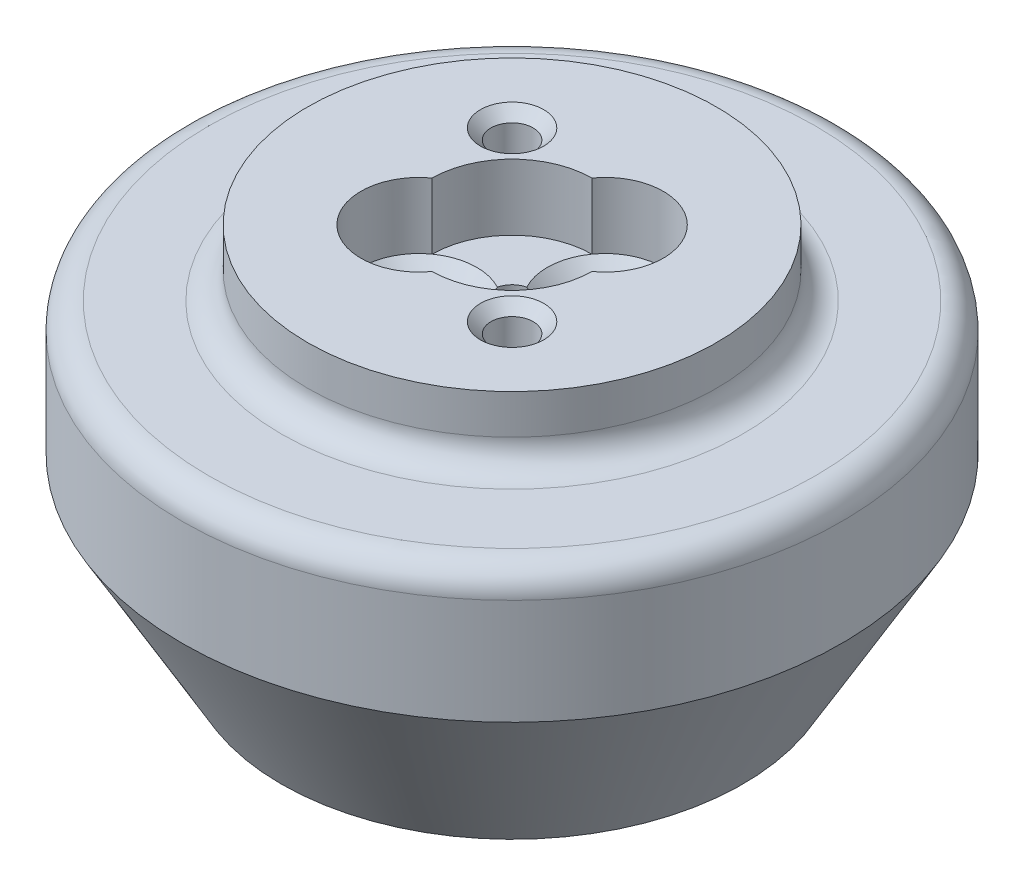
ISO-10303-21;
HEADER;
FILE_DESCRIPTION(('STEP AP214'),'2;1');
FILE_NAME('part.step','',(''),(''),'','','');
FILE_SCHEMA(('AUTOMOTIVE_DESIGN { 1 0 10303 214 1 1 1 1 }'));
ENDSEC;
DATA;
#1=APPLICATION_CONTEXT('core data for automotive mechanical design processes');
#2=APPLICATION_PROTOCOL_DEFINITION('international standard','automotive_design',2000,#1);
#3=PRODUCT_CONTEXT('',#1,'mechanical');
#4=PRODUCT('Part','Part','',(#3));
#5=PRODUCT_RELATED_PRODUCT_CATEGORY('part','',(#4));
#6=PRODUCT_DEFINITION_FORMATION('','',#4);
#7=PRODUCT_DEFINITION_CONTEXT('part definition',#1,'design');
#8=PRODUCT_DEFINITION('design','',#6,#7);
#9=PRODUCT_DEFINITION_SHAPE('','',#8);
#10=(LENGTH_UNIT() NAMED_UNIT(*) SI_UNIT(.MILLI.,.METRE.));
#11=(NAMED_UNIT(*) PLANE_ANGLE_UNIT() SI_UNIT($,.RADIAN.));
#12=(NAMED_UNIT(*) SI_UNIT($,.STERADIAN.) SOLID_ANGLE_UNIT());
#13=UNCERTAINTY_MEASURE_WITH_UNIT(LENGTH_MEASURE(1.E-05),#10,'distance_accuracy_value','');
#14=(GEOMETRIC_REPRESENTATION_CONTEXT(3) GLOBAL_UNCERTAINTY_ASSIGNED_CONTEXT((#13)) GLOBAL_UNIT_ASSIGNED_CONTEXT((#10,
#11,#12)) REPRESENTATION_CONTEXT('',''));
#15=CARTESIAN_POINT('',(0.,0.,0.));
#16=DIRECTION('',(0.,0.,1.));
#17=DIRECTION('',(1.,0.,0.));
#18=AXIS2_PLACEMENT_3D('',#15,#16,#17);
#19=CARTESIAN_POINT('',(0.,14.,0.));
#20=DIRECTION('',(0.,-1.,0.));
#21=DIRECTION('',(0.,0.,-1.));
#22=AXIS2_PLACEMENT_3D('',#19,#20,#21);
#23=CYLINDRICAL_SURFACE('',#22,3.05);
#24=DIRECTION('',(0.,1.,0.));
#25=VECTOR('',#24,1.);
#26=CARTESIAN_POINT('',(3.04993454359712,12.75,0.0199819862127667));
#27=LINE('',#26,#25);
#28=CARTESIAN_POINT('',(3.04993454359712,11.5,0.0199819862127656));
#29=VERTEX_POINT('',#28);
#30=CARTESIAN_POINT('',(3.04993454359712,14.,0.0199819862127667));
#31=VERTEX_POINT('',#30);
#32=EDGE_CURVE('E256',#29,#31,#27,.T.);
#33=ORIENTED_EDGE('',*,*,#32,.F.);
#34=CARTESIAN_POINT('',(0.,11.5,0.));
#35=DIRECTION('',(0.,1.,0.));
#36=DIRECTION('',(0.,0.,1.));
#37=AXIS2_PLACEMENT_3D('',#34,#35,#36);
#38=CIRCLE('',#37,3.05);
#39=CARTESIAN_POINT('',(0.0199819862127659,11.5,3.04993454359712));
#40=VERTEX_POINT('',#39);
#41=EDGE_CURVE('E133',#29,#40,#38,.F.);
#42=ORIENTED_EDGE('',*,*,#41,.T.);
#43=DIRECTION('',(0.,1.,0.));
#44=VECTOR('',#43,1.);
#45=CARTESIAN_POINT('',(0.0199819862127728,12.75,3.04993454359712));
#46=LINE('',#45,#44);
#47=CARTESIAN_POINT('',(0.019981986212773,14.,3.04993454359712));
#48=VERTEX_POINT('',#47);
#49=EDGE_CURVE('E69',#48,#40,#46,.F.);
#50=ORIENTED_EDGE('',*,*,#49,.F.);
#51=CARTESIAN_POINT('',(0.,14.,0.));
#52=DIRECTION('',(0.,1.,0.));
#53=DIRECTION('',(0.,0.,1.));
#54=AXIS2_PLACEMENT_3D('',#51,#52,#53);
#55=CIRCLE('',#54,3.05);
#56=EDGE_CURVE('E260',#48,#31,#55,.T.);
#57=ORIENTED_EDGE('',*,*,#56,.T.);
#58=EDGE_LOOP('',(#33,#42,#50,#57));
#59=FACE_BOUND('',#58,.T.);
#60=ADVANCED_FACE('F45',(#59),#23,.F.);
#61=CARTESIAN_POINT('',(0.,11.5,0.));
#62=DIRECTION('',(0.,1.,0.));
#63=DIRECTION('',(0.,0.,1.));
#64=AXIS2_PLACEMENT_3D('',#61,#62,#63);
#65=PLANE('',#64);
#66=CARTESIAN_POINT('',(0.,11.5,0.));
#67=DIRECTION('',(0.,1.,0.));
#68=DIRECTION('',(0.,0.,1.));
#69=AXIS2_PLACEMENT_3D('',#66,#67,#68);
#70=CIRCLE('',#69,0.75);
#71=CARTESIAN_POINT('',(0.172083928690773,11.5,0.729991179046945));
#72=VERTEX_POINT('',#71);
#73=CARTESIAN_POINT('',(0.729991179046948,11.5,0.17208392869076));
#74=VERTEX_POINT('',#73);
#75=EDGE_CURVE('E186',#72,#74,#70,.T.);
#76=ORIENTED_EDGE('',*,*,#75,.F.);
#77=CARTESIAN_POINT('',(-1.76776695296636,11.5,1.76776695296636));
#78=DIRECTION('',(0.,1.,0.));
#79=DIRECTION('',(0.,0.,1.));
#80=AXIS2_PLACEMENT_3D('',#77,#78,#79);
#81=CIRCLE('',#80,2.2);
#82=EDGE_CURVE('E109',#40,#72,#81,.T.);
#83=ORIENTED_EDGE('',*,*,#82,.F.);
#84=ORIENTED_EDGE('',*,*,#41,.F.);
#85=CARTESIAN_POINT('',(1.76776695296637,11.5,-1.76776695296637));
#86=DIRECTION('',(0.,1.,0.));
#87=DIRECTION('',(0.,0.,1.));
#88=AXIS2_PLACEMENT_3D('',#85,#86,#87);
#89=CIRCLE('',#88,2.2);
#90=EDGE_CURVE('E153',#74,#29,#89,.T.);
#91=ORIENTED_EDGE('',*,*,#90,.F.);
#92=EDGE_LOOP('',(#76,#83,#84,#91));
#93=FACE_BOUND('',#92,.T.);
#94=ADVANCED_FACE('F214',(#93),#65,.T.);
#95=CARTESIAN_POINT('',(0.,0.,0.));
#96=DIRECTION('',(0.,1.,0.));
#97=DIRECTION('',(0.,0.,1.));
#98=AXIS2_PLACEMENT_3D('',#95,#96,#97);
#99=PLANE('',#98);
#100=CARTESIAN_POINT('',(0.,0.,0.));
#101=DIRECTION('',(0.,1.,0.));
#102=DIRECTION('',(0.,0.,1.));
#103=AXIS2_PLACEMENT_3D('',#100,#101,#102);
#104=CIRCLE('',#103,8.75);
#105=CARTESIAN_POINT('',(0.,0.,8.75));
#106=VERTEX_POINT('',#105);
#107=EDGE_CURVE('E134',#106,#106,#104,.F.);
#108=ORIENTED_EDGE('',*,*,#107,.T.);
#109=EDGE_LOOP('',(#108));
#110=FACE_BOUND('',#109,.T.);
#111=CARTESIAN_POINT('',(0.,0.,0.));
#112=DIRECTION('',(0.,1.,0.));
#113=DIRECTION('',(0.,0.,1.));
#114=AXIS2_PLACEMENT_3D('',#111,#112,#113);
#115=CIRCLE('',#114,7.14375);
#116=CARTESIAN_POINT('',(0.,0.,7.14375));
#117=VERTEX_POINT('',#116);
#118=EDGE_CURVE('E290',#117,#117,#115,.T.);
#119=ORIENTED_EDGE('',*,*,#118,.T.);
#120=EDGE_LOOP('',(#119));
#121=FACE_BOUND('',#120,.T.);
#122=ADVANCED_FACE('F223',(#110,#121),#99,.F.);
#123=CARTESIAN_POINT('',(0.,10.,0.));
#124=DIRECTION('',(0.,-1.,0.));
#125=DIRECTION('',(0.,0.,-1.));
#126=AXIS2_PLACEMENT_3D('',#123,#124,#125);
#127=CYLINDRICAL_SURFACE('',#126,12.5);
#128=CARTESIAN_POINT('',(0.,10.5,0.));
#129=DIRECTION('',(0.,1.,0.));
#130=DIRECTION('',(0.,0.,1.));
#131=AXIS2_PLACEMENT_3D('',#128,#129,#130);
#132=CIRCLE('',#131,12.5);
#133=CARTESIAN_POINT('',(0.,10.5,12.5));
#134=VERTEX_POINT('',#133);
#135=EDGE_CURVE('E11',#134,#134,#132,.F.);
#136=ORIENTED_EDGE('',*,*,#135,.T.);
#137=EDGE_LOOP('',(#136));
#138=FACE_BOUND('',#137,.T.);
#139=CARTESIAN_POINT('',(0.,6.49519052838328,0.));
#140=DIRECTION('',(0.,1.,0.));
#141=DIRECTION('',(0.,0.,1.));
#142=AXIS2_PLACEMENT_3D('',#139,#140,#141);
#143=CIRCLE('',#142,12.5);
#144=CARTESIAN_POINT('',(0.,6.49519052838328,12.5));
#145=VERTEX_POINT('',#144);
#146=EDGE_CURVE('E140',#145,#145,#143,.T.);
#147=ORIENTED_EDGE('',*,*,#146,.T.);
#148=EDGE_LOOP('',(#147));
#149=FACE_BOUND('',#148,.T.);
#150=ADVANCED_FACE('F221',(#138,#149),#127,.T.);
#151=CARTESIAN_POINT('',(0.,10.,0.));
#152=DIRECTION('',(0.,-1.,0.));
#153=DIRECTION('',(0.,0.,-1.));
#154=AXIS2_PLACEMENT_3D('',#151,#152,#153);
#155=CYLINDRICAL_SURFACE('',#154,7.14375);
#156=CARTESIAN_POINT('',(0.,10.,0.));
#157=DIRECTION('',(0.,1.,0.));
#158=DIRECTION('',(0.,0.,1.));
#159=AXIS2_PLACEMENT_3D('',#156,#157,#158);
#160=CIRCLE('',#159,7.14375);
#161=CARTESIAN_POINT('',(0.,10.,7.14375));
#162=VERTEX_POINT('',#161);
#163=EDGE_CURVE('E286',#162,#162,#160,.T.);
#164=ORIENTED_EDGE('',*,*,#163,.T.);
#165=EDGE_LOOP('',(#164));
#166=FACE_BOUND('',#165,.T.);
#167=ORIENTED_EDGE('',*,*,#118,.F.);
#168=EDGE_LOOP('',(#167));
#169=FACE_BOUND('',#168,.T.);
#170=ADVANCED_FACE('F217',(#166,#169),#155,.F.);
#171=CARTESIAN_POINT('',(0.,10.,0.));
#172=DIRECTION('',(0.,1.,0.));
#173=DIRECTION('',(0.,0.,1.));
#174=AXIS2_PLACEMENT_3D('',#171,#172,#173);
#175=PLANE('',#174);
#176=CARTESIAN_POINT('',(3.18198051533945,10.,3.18198051533946));
#177=DIRECTION('',(0.,1.,0.));
#178=DIRECTION('',(0.,0.,1.));
#179=AXIS2_PLACEMENT_3D('',#176,#177,#178);
#180=CIRCLE('',#179,0.799999999999992);
#181=CARTESIAN_POINT('',(3.18198051533945,10.,3.98198051533946));
#182=VERTEX_POINT('',#181);
#183=EDGE_CURVE('E536',#182,#182,#180,.T.);
#184=ORIENTED_EDGE('',*,*,#183,.T.);
#185=EDGE_LOOP('',(#184));
#186=FACE_BOUND('',#185,.T.);
#187=CARTESIAN_POINT('',(-3.18198051533946,10.,-3.18198051533948));
#188=DIRECTION('',(0.,1.,0.));
#189=DIRECTION('',(0.,0.,1.));
#190=AXIS2_PLACEMENT_3D('',#187,#188,#189);
#191=CIRCLE('',#190,0.799999999999992);
#192=CARTESIAN_POINT('',(-3.18198051533946,10.,-2.38198051533949));
#193=VERTEX_POINT('',#192);
#194=EDGE_CURVE('E164',#193,#193,#191,.T.);
#195=ORIENTED_EDGE('',*,*,#194,.T.);
#196=EDGE_LOOP('',(#195));
#197=FACE_BOUND('',#196,.T.);
#198=CARTESIAN_POINT('',(0.,10.,0.));
#199=DIRECTION('',(0.,1.,0.));
#200=DIRECTION('',(0.,0.,1.));
#201=AXIS2_PLACEMENT_3D('',#198,#199,#200);
#202=CIRCLE('',#201,0.75);
#203=CARTESIAN_POINT('',(0.,10.,0.75));
#204=VERTEX_POINT('',#203);
#205=EDGE_CURVE('E107',#204,#204,#202,.T.);
#206=ORIENTED_EDGE('',*,*,#205,.T.);
#207=EDGE_LOOP('',(#206));
#208=FACE_BOUND('',#207,.T.);
#209=CARTESIAN_POINT('',(-1.76776695296636,10.,1.76776695296636));
#210=DIRECTION('',(0.,1.,0.));
#211=DIRECTION('',(0.,0.,1.));
#212=AXIS2_PLACEMENT_3D('',#209,#210,#211);
#213=CIRCLE('',#212,1.2);
#214=CARTESIAN_POINT('',(-1.76776695296636,10.,2.96776695296636));
#215=VERTEX_POINT('',#214);
#216=EDGE_CURVE('E149',#215,#215,#213,.T.);
#217=ORIENTED_EDGE('',*,*,#216,.T.);
#218=EDGE_LOOP('',(#217));
#219=FACE_BOUND('',#218,.T.);
#220=CARTESIAN_POINT('',(1.76776695296637,10.,-1.76776695296637));
#221=DIRECTION('',(0.,1.,0.));
#222=DIRECTION('',(0.,0.,1.));
#223=AXIS2_PLACEMENT_3D('',#220,#221,#222);
#224=CIRCLE('',#223,1.2);
#225=CARTESIAN_POINT('',(1.76776695296637,10.,-0.567766952966373));
#226=VERTEX_POINT('',#225);
#227=EDGE_CURVE('E144',#226,#226,#224,.T.);
#228=ORIENTED_EDGE('',*,*,#227,.T.);
#229=EDGE_LOOP('',(#228));
#230=FACE_BOUND('',#229,.T.);
#231=ORIENTED_EDGE('',*,*,#163,.F.);
#232=EDGE_LOOP('',(#231));
#233=FACE_BOUND('',#232,.T.);
#234=ADVANCED_FACE('F212',(#186,#197,#208,#219,#230,#233),#175,.F.);
#235=CARTESIAN_POINT('',(0.,11.5,0.));
#236=DIRECTION('',(0.,1.,0.));
#237=DIRECTION('',(0.,0.,1.));
#238=AXIS2_PLACEMENT_3D('',#235,#236,#237);
#239=CIRCLE('',#238,8.75);
#240=CARTESIAN_POINT('',(0.,11.5,8.75));
#241=VERTEX_POINT('',#240);
#242=EDGE_CURVE('E54',#241,#241,#239,.F.);
#243=ORIENTED_EDGE('',*,*,#242,.T.);
#244=EDGE_LOOP('',(#243));
#245=FACE_BOUND('',#244,.T.);
#246=CARTESIAN_POINT('',(0.,11.5,0.));
#247=DIRECTION('',(0.,1.,0.));
#248=DIRECTION('',(0.,0.,1.));
#249=AXIS2_PLACEMENT_3D('',#246,#247,#248);
#250=CIRCLE('',#249,11.5);
#251=CARTESIAN_POINT('',(0.,11.5,11.5));
#252=VERTEX_POINT('',#251);
#253=EDGE_CURVE('E568',#252,#252,#250,.T.);
#254=ORIENTED_EDGE('',*,*,#253,.T.);
#255=EDGE_LOOP('',(#254));
#256=FACE_BOUND('',#255,.T.);
#257=ADVANCED_FACE('F209',(#245,#256),#65,.T.);
#258=CARTESIAN_POINT('',(0.,6.49519052838328,0.));
#259=DIRECTION('',(0.,1.,0.));
#260=DIRECTION('',(0.,0.,1.));
#261=AXIS2_PLACEMENT_3D('',#258,#259,#260);
#262=CONICAL_SURFACE('',#261,12.5,0.5235987755983);
#263=ORIENTED_EDGE('',*,*,#107,.F.);
#264=EDGE_LOOP('',(#263));
#265=FACE_BOUND('',#264,.T.);
#266=ORIENTED_EDGE('',*,*,#146,.F.);
#267=EDGE_LOOP('',(#266));
#268=FACE_BOUND('',#267,.T.);
#269=ADVANCED_FACE('F204',(#265,#268),#262,.T.);
#270=CARTESIAN_POINT('',(0.,14.,0.));
#271=DIRECTION('',(0.,1.,0.));
#272=DIRECTION('',(0.,0.,1.));
#273=AXIS2_PLACEMENT_3D('',#270,#271,#272);
#274=PLANE('',#273);
#275=CARTESIAN_POINT('',(1.76776695296637,14.,-1.76776695296637));
#276=DIRECTION('',(0.,1.,0.));
#277=DIRECTION('',(0.,0.,1.));
#278=AXIS2_PLACEMENT_3D('',#275,#276,#277);
#279=CIRCLE('',#278,2.2);
#280=CARTESIAN_POINT('',(-0.0199819862127686,14.,-3.04993454359712));
#281=VERTEX_POINT('',#280);
#282=EDGE_CURVE('E553',#31,#281,#279,.T.);
#283=ORIENTED_EDGE('',*,*,#282,.F.);
#284=ORIENTED_EDGE('',*,*,#56,.F.);
#285=CARTESIAN_POINT('',(-1.76776695296636,14.,1.76776695296636));
#286=DIRECTION('',(0.,1.,0.));
#287=DIRECTION('',(0.,0.,1.));
#288=AXIS2_PLACEMENT_3D('',#285,#286,#287);
#289=CIRCLE('',#288,2.2);
#290=CARTESIAN_POINT('',(-3.04993454359712,14.,-0.0199819862127656));
#291=VERTEX_POINT('',#290);
#292=EDGE_CURVE('E550',#291,#48,#289,.T.);
#293=ORIENTED_EDGE('',*,*,#292,.F.);
#294=EDGE_CURVE('E119',#281,#291,#55,.T.);
#295=ORIENTED_EDGE('',*,*,#294,.F.);
#296=EDGE_LOOP('',(#283,#284,#293,#295));
#297=FACE_BOUND('',#296,.T.);
#298=CARTESIAN_POINT('',(3.18198051533945,14.,3.18198051533946));
#299=DIRECTION('',(0.,1.,0.));
#300=DIRECTION('',(0.,0.,1.));
#301=AXIS2_PLACEMENT_3D('',#298,#299,#300);
#302=CIRCLE('',#301,1.2);
#303=CARTESIAN_POINT('',(3.18198051533945,14.,4.38198051533946));
#304=VERTEX_POINT('',#303);
#305=EDGE_CURVE('E263',#304,#304,#302,.T.);
#306=ORIENTED_EDGE('',*,*,#305,.F.);
#307=EDGE_LOOP('',(#306));
#308=FACE_BOUND('',#307,.T.);
#309=CARTESIAN_POINT('',(-3.18198051533946,14.,-3.18198051533948));
#310=DIRECTION('',(0.,1.,0.));
#311=DIRECTION('',(0.,0.,1.));
#312=AXIS2_PLACEMENT_3D('',#309,#310,#311);
#313=CIRCLE('',#312,1.2);
#314=CARTESIAN_POINT('',(-3.18198051533946,14.,-1.98198051533948));
#315=VERTEX_POINT('',#314);
#316=EDGE_CURVE('E533',#315,#315,#313,.T.);
#317=ORIENTED_EDGE('',*,*,#316,.F.);
#318=EDGE_LOOP('',(#317));
#319=FACE_BOUND('',#318,.T.);
#320=CARTESIAN_POINT('',(0.,14.,0.));
#321=DIRECTION('',(0.,1.,0.));
#322=DIRECTION('',(0.,0.,1.));
#323=AXIS2_PLACEMENT_3D('',#320,#321,#322);
#324=CIRCLE('',#323,7.75);
#325=CARTESIAN_POINT('',(0.,14.,7.75));
#326=VERTEX_POINT('',#325);
#327=EDGE_CURVE('E282',#326,#326,#324,.T.);
#328=ORIENTED_EDGE('',*,*,#327,.T.);
#329=EDGE_LOOP('',(#328));
#330=FACE_BOUND('',#329,.T.);
#331=ADVANCED_FACE('F201',(#297,#308,#319,#330),#274,.T.);
#332=CARTESIAN_POINT('',(0.,14.,0.));
#333=DIRECTION('',(0.,-1.,0.));
#334=DIRECTION('',(0.,0.,-1.));
#335=AXIS2_PLACEMENT_3D('',#332,#333,#334);
#336=CYLINDRICAL_SURFACE('',#335,7.75);
#337=CARTESIAN_POINT('',(0.,12.5,0.));
#338=DIRECTION('',(0.,1.,0.));
#339=DIRECTION('',(0.,0.,1.));
#340=AXIS2_PLACEMENT_3D('',#337,#338,#339);
#341=CIRCLE('',#340,7.75);
#342=CARTESIAN_POINT('',(0.,12.5,7.75));
#343=VERTEX_POINT('',#342);
#344=EDGE_CURVE('E163',#343,#343,#341,.T.);
#345=ORIENTED_EDGE('',*,*,#344,.T.);
#346=EDGE_LOOP('',(#345));
#347=FACE_BOUND('',#346,.T.);
#348=ORIENTED_EDGE('',*,*,#327,.F.);
#349=EDGE_LOOP('',(#348));
#350=FACE_BOUND('',#349,.T.);
#351=ADVANCED_FACE('F200',(#347,#350),#336,.T.);
#352=DIRECTION('',(0.,1.,0.));
#353=VECTOR('',#352,1.);
#354=CARTESIAN_POINT('',(-0.0199819862127689,12.75,-3.04993454359712));
#355=LINE('',#354,#353);
#356=CARTESIAN_POINT('',(-0.0199819862127613,11.5,-3.04993454359712));
#357=VERTEX_POINT('',#356);
#358=EDGE_CURVE('E121',#281,#357,#355,.F.);
#359=ORIENTED_EDGE('',*,*,#358,.F.);
#360=ORIENTED_EDGE('',*,*,#294,.T.);
#361=DIRECTION('',(0.,1.,0.));
#362=VECTOR('',#361,1.);
#363=CARTESIAN_POINT('',(-3.04993454359712,12.75,-0.0199819862127656));
#364=LINE('',#363,#362);
#365=CARTESIAN_POINT('',(-3.04993454359712,11.5,-0.0199819862127654));
#366=VERTEX_POINT('',#365);
#367=EDGE_CURVE('E99',#366,#291,#364,.T.);
#368=ORIENTED_EDGE('',*,*,#367,.F.);
#369=EDGE_CURVE('E116',#366,#357,#38,.F.);
#370=ORIENTED_EDGE('',*,*,#369,.T.);
#371=EDGE_LOOP('',(#359,#360,#368,#370));
#372=FACE_BOUND('',#371,.T.);
#373=ADVANCED_FACE('F114',(#372),#23,.F.);
#374=CARTESIAN_POINT('',(-0.172083928690761,11.5,-0.729991179046948));
#375=VERTEX_POINT('',#374);
#376=CARTESIAN_POINT('',(-0.729991179046946,11.5,-0.172083928690771));
#377=VERTEX_POINT('',#376);
#378=EDGE_CURVE('E61',#375,#377,#70,.T.);
#379=ORIENTED_EDGE('',*,*,#378,.F.);
#380=EDGE_CURVE('E131',#357,#375,#89,.T.);
#381=ORIENTED_EDGE('',*,*,#380,.F.);
#382=ORIENTED_EDGE('',*,*,#369,.F.);
#383=EDGE_CURVE('E106',#377,#366,#81,.T.);
#384=ORIENTED_EDGE('',*,*,#383,.F.);
#385=EDGE_LOOP('',(#379,#381,#382,#384));
#386=FACE_BOUND('',#385,.T.);
#387=ADVANCED_FACE('F129',(#386),#65,.T.);
#388=CARTESIAN_POINT('',(1.76776695296637,11.5,-1.76776695296637));
#389=DIRECTION('',(0.,1.,0.));
#390=DIRECTION('',(0.,0.,1.));
#391=AXIS2_PLACEMENT_3D('',#388,#389,#390);
#392=CYLINDRICAL_SURFACE('',#391,1.2);
#393=CARTESIAN_POINT('',(1.76776695296637,10.5,-1.76776695296637));
#394=DIRECTION('',(0.,1.,0.));
#395=DIRECTION('',(0.,0.,1.));
#396=AXIS2_PLACEMENT_3D('',#393,#394,#395);
#397=CIRCLE('',#396,1.2);
#398=CARTESIAN_POINT('',(1.76776695296637,10.5,-0.567766952966372));
#399=VERTEX_POINT('',#398);
#400=EDGE_CURVE('E148',#399,#399,#397,.T.);
#401=ORIENTED_EDGE('',*,*,#400,.T.);
#402=EDGE_LOOP('',(#401));
#403=FACE_BOUND('',#402,.T.);
#404=ORIENTED_EDGE('',*,*,#227,.F.);
#405=EDGE_LOOP('',(#404));
#406=FACE_BOUND('',#405,.T.);
#407=ADVANCED_FACE('F193',(#403,#406),#392,.F.);
#408=CARTESIAN_POINT('',(1.76776695296637,11.5,-1.76776695296637));
#409=DIRECTION('',(0.,1.,0.));
#410=DIRECTION('',(0.,0.,1.));
#411=AXIS2_PLACEMENT_3D('',#408,#409,#410);
#412=CONICAL_SURFACE('',#411,2.2,0.785398163397449);
#413=ORIENTED_EDGE('',*,*,#400,.F.);
#414=EDGE_LOOP('',(#413));
#415=FACE_BOUND('',#414,.T.);
#416=ORIENTED_EDGE('',*,*,#380,.T.);
#417=CARTESIAN_POINT('',(-0.172285334105615,11.5002,-0.729943671561112));
#418=CARTESIAN_POINT('',(-0.15026574431929,11.4783415114414,-0.73513409186383));
#419=CARTESIAN_POINT('',(-0.127874934082506,11.4566160623447,-0.739373397222493));
#420=CARTESIAN_POINT('',(-0.0823321743637659,11.4135658071539,-0.745824564830232));
#421=CARTESIAN_POINT('',(-0.0591786307614863,11.3922420086527,-0.748031859638822));
#422=CARTESIAN_POINT('',(-0.0118924919179092,11.3499626191586,-0.750283517893335));
#423=CARTESIAN_POINT('',(0.0122488007876122,11.3290151389326,-0.750300067765384));
#424=CARTESIAN_POINT('',(0.0611711306133391,11.2880676432624,-0.747902026619428));
#425=CARTESIAN_POINT('',(0.0859514967701411,11.268066691991,-0.745489891725413));
#426=CARTESIAN_POINT('',(0.140148951968831,11.226260286503,-0.737377376895848));
#427=CARTESIAN_POINT('',(0.169673506780041,11.2046781815505,-0.731212603559672));
#428=CARTESIAN_POINT('',(0.229312349645665,11.1641728829095,-0.714750847635024));
#429=CARTESIAN_POINT('',(0.259424498681351,11.1452415655469,-0.70446688027844));
#430=CARTESIAN_POINT('',(0.314120346228858,11.11449980292,-0.681565437832813));
#431=CARTESIAN_POINT('',(0.33866345724226,11.1020198694212,-0.669766733717619));
#432=CARTESIAN_POINT('',(0.387423615104856,11.0805255780028,-0.642787103101383));
#433=CARTESIAN_POINT('',(0.411641084466471,11.0715062034521,-0.627611123348621));
#434=CARTESIAN_POINT('',(0.454957865045917,11.0590414224015,-0.59673784936397));
#435=CARTESIAN_POINT('',(0.474229762438019,11.054911036765,-0.581563400096576));
#436=CARTESIAN_POINT('',(0.511416056306155,11.0501015439613,-0.549145369499031));
#437=CARTESIAN_POINT('',(0.529331274820763,11.0494203301213,-0.531903057760694));
#438=CARTESIAN_POINT('',(0.563248332119565,11.0515804497783,-0.495846815684968));
#439=CARTESIAN_POINT('',(0.579250711737494,11.0544207850016,-0.477033332146391));
#440=CARTESIAN_POINT('',(0.609002791617074,11.0633272019171,-0.438419350763644));
#441=CARTESIAN_POINT('',(0.62275064293052,11.0693959140778,-0.41861805999815));
#442=CARTESIAN_POINT('',(0.65211568487577,11.0867477132853,-0.371811602860871));
#443=CARTESIAN_POINT('',(0.666805537465332,11.099098213108,-0.344624203900892));
#444=CARTESIAN_POINT('',(0.692218688271403,11.1273430549573,-0.29024048596479));
#445=CARTESIAN_POINT('',(0.702932706816382,11.143245550666,-0.263044292575356));
#446=CARTESIAN_POINT('',(0.725595513985824,11.1866411765949,-0.194708784979744));
#447=CARTESIAN_POINT('',(0.735167581989374,11.215799057844,-0.153850814693813));
#448=CARTESIAN_POINT('',(0.747481706029791,11.2774641547666,-0.0736378748125615));
#449=CARTESIAN_POINT('',(0.750203981434023,11.3099807889088,-0.0342875805295565));
#450=CARTESIAN_POINT('',(0.749824787484645,11.3688298044312,0.0333592904023769));
#451=CARTESIAN_POINT('',(0.747971494152806,11.3947581602664,0.0620294405192454));
#452=CARTESIAN_POINT('',(0.74117723164978,11.4471319577941,0.118071149994519));
#453=CARTESIAN_POINT('',(0.736262356830101,11.4735712181788,0.145451601647388));
#454=CARTESIAN_POINT('',(0.729943671560099,11.5002000000043,0.172285334109908));
#455=B_SPLINE_CURVE_WITH_KNOTS('',3,(#417,#418,#419,#420,#421,#422,#423,#424,#425,#426,#427,
#428,#429,#430,#431,#432,#433,#434,#435,#436,#437,#438,#439,#440,#441,#442,#443,#444,#445,#446,
#447,#448,#449,#450,#451,#452,#453,#454),.UNSPECIFIED.,.F.,.F.,(4,2,2,2,2,2,2,2,2,2,2,2,2,2,2,2,
2,2,4),(0.,0.0943720462504917,0.188955702477188,0.284740073749316,0.380427675676983,
0.491426238768406,0.602076816917456,0.691630234529731,0.781053335234203,0.855343346051034,
0.929587976802916,1.00381156581537,1.07809572474755,1.17737318846527,1.27688093157678,
1.42933945888639,1.58223774883791,1.69819377609594,1.81317476493806),.UNSPECIFIED.);
#456=EDGE_CURVE('E176',#375,#74,#455,.T.);
#457=ORIENTED_EDGE('',*,*,#456,.T.);
#458=ORIENTED_EDGE('',*,*,#90,.T.);
#459=EDGE_CURVE('E267',#29,#357,#89,.T.);
#460=ORIENTED_EDGE('',*,*,#459,.T.);
#461=EDGE_LOOP('',(#416,#457,#458,#460));
#462=FACE_BOUND('',#461,.T.);
#463=ADVANCED_FACE('F188',(#415,#462),#412,.F.);
#464=CARTESIAN_POINT('',(-1.76776695296636,11.5,1.76776695296636));
#465=DIRECTION('',(0.,1.,0.));
#466=DIRECTION('',(0.,0.,1.));
#467=AXIS2_PLACEMENT_3D('',#464,#465,#466);
#468=CYLINDRICAL_SURFACE('',#467,1.2);
#469=CARTESIAN_POINT('',(-1.76776695296636,10.5,1.76776695296636));
#470=DIRECTION('',(0.,1.,0.));
#471=DIRECTION('',(0.,0.,1.));
#472=AXIS2_PLACEMENT_3D('',#469,#470,#471);
#473=CIRCLE('',#472,1.2);
#474=CARTESIAN_POINT('',(-1.76776695296636,10.5,2.96776695296636));
#475=VERTEX_POINT('',#474);
#476=EDGE_CURVE('E154',#475,#475,#473,.T.);
#477=ORIENTED_EDGE('',*,*,#476,.T.);
#478=EDGE_LOOP('',(#477));
#479=FACE_BOUND('',#478,.T.);
#480=ORIENTED_EDGE('',*,*,#216,.F.);
#481=EDGE_LOOP('',(#480));
#482=FACE_BOUND('',#481,.T.);
#483=ADVANCED_FACE('F192',(#479,#482),#468,.F.);
#484=CARTESIAN_POINT('',(-1.76776695296636,11.5,1.76776695296636));
#485=DIRECTION('',(0.,1.,0.));
#486=DIRECTION('',(0.,0.,1.));
#487=AXIS2_PLACEMENT_3D('',#484,#485,#486);
#488=CONICAL_SURFACE('',#487,2.2,0.785398163397449);
#489=ORIENTED_EDGE('',*,*,#476,.F.);
#490=EDGE_LOOP('',(#489));
#491=FACE_BOUND('',#490,.T.);
#492=ORIENTED_EDGE('',*,*,#82,.T.);
#493=CARTESIAN_POINT('',(0.172285334107781,11.5002000000068,0.729943671565709));
#494=CARTESIAN_POINT('',(0.150265744322665,11.4783415114463,0.735134091864996));
#495=CARTESIAN_POINT('',(0.127874934086427,11.4566160623489,0.739373397222316));
#496=CARTESIAN_POINT('',(0.0823321743681669,11.4135658071575,0.745824564829229));
#497=CARTESIAN_POINT('',(0.0591786307658173,11.3922420086566,0.748031859638338));
#498=CARTESIAN_POINT('',(0.011892491922219,11.3499626191625,0.750283517893411));
#499=CARTESIAN_POINT('',(-0.0122488007832523,11.3290151389363,0.750300067765494));
#500=CARTESIAN_POINT('',(-0.0611711306089127,11.2880676432659,0.747902026619748));
#501=CARTESIAN_POINT('',(-0.0859514967656979,11.2680666919945,0.745489891725912));
#502=CARTESIAN_POINT('',(-0.140148951964474,11.2262602865063,0.737377376896694));
#503=CARTESIAN_POINT('',(-0.169673506775788,11.2046781815535,0.731212603560666));
#504=CARTESIAN_POINT('',(-0.229312349641638,11.164172882912,0.714750847636315));
#505=CARTESIAN_POINT('',(-0.259424498677444,11.1452415655493,0.70446688027988));
#506=CARTESIAN_POINT('',(-0.314120346225249,11.1144998029219,0.681565437834482));
#507=CARTESIAN_POINT('',(-0.338663457238825,11.1020198694229,0.669766733719362));
#508=CARTESIAN_POINT('',(-0.387423615101793,11.080525578004,0.642787103103235));
#509=CARTESIAN_POINT('',(-0.411641084463608,11.0715062034531,0.627611123350507));
#510=CARTESIAN_POINT('',(-0.454957865043325,11.0590414224021,0.596737849365947));
#511=CARTESIAN_POINT('',(-0.4742297624355,11.0549110367655,0.581563400098631));
#512=CARTESIAN_POINT('',(-0.511416056303803,11.0501015439615,0.549145369501223));
#513=CARTESIAN_POINT('',(-0.529331274818506,11.0494203301213,0.531903057762943));
#514=CARTESIAN_POINT('',(-0.563248332117515,11.051580449778,0.495846815687298));
#515=CARTESIAN_POINT('',(-0.579250711735558,11.0544207850011,0.477033332148745));
#516=CARTESIAN_POINT('',(-0.609002791615366,11.0633272019164,0.438419350766019));
#517=CARTESIAN_POINT('',(-0.622750642928928,11.069395914077,0.418618060000522));
#518=CARTESIAN_POINT('',(-0.652115684874307,11.0867477132842,0.371811602863422));
#519=CARTESIAN_POINT('',(-0.666805537463914,11.0990982131067,0.344624203903624));
#520=CARTESIAN_POINT('',(-0.692218688270108,11.1273430549556,0.290240485967865));
#521=CARTESIAN_POINT('',(-0.702932706815166,11.143245550664,0.263044292578591));
#522=CARTESIAN_POINT('',(-0.725595513984815,11.1866411765923,0.194708784983443));
#523=CARTESIAN_POINT('',(-0.735167581988526,11.215799057841,0.153850814697801));
#524=CARTESIAN_POINT('',(-0.747481706029331,11.277464154763,0.0736378748170927));
#525=CARTESIAN_POINT('',(-0.750203981433793,11.3099807889048,0.0342875805343409));
#526=CARTESIAN_POINT('',(-0.749824787484868,11.3688298044269,-0.0333592903974828));
#527=CARTESIAN_POINT('',(-0.747971494153205,11.394758160262,-0.0620294405144768));
#528=CARTESIAN_POINT('',(-0.741177231650504,11.4471319577897,-0.118071149989996));
#529=CARTESIAN_POINT('',(-0.736262356830973,11.4735712181745,-0.145451601642985));
#530=CARTESIAN_POINT('',(-0.72994367156111,11.5002,-0.172285334105625));
#531=B_SPLINE_CURVE_WITH_KNOTS('',3,(#493,#494,#495,#496,#497,#498,#499,#500,#501,#502,#503,
#504,#505,#506,#507,#508,#509,#510,#511,#512,#513,#514,#515,#516,#517,#518,#519,#520,#521,#522,
#523,#524,#525,#526,#527,#528,#529,#530),.UNSPECIFIED.,.F.,.F.,(4,2,2,2,2,2,2,2,2,2,2,2,2,2,2,2,
2,2,4),(0.,0.0943720462503144,0.188955702476966,0.284740073749192,0.380427675676909,
0.491426238768879,0.602076816918452,0.691630234531353,0.781053335236457,0.85534334605339,
0.929587976805368,1.00381156581794,1.07809572475023,1.17737318846733,1.27688093157821,
1.42933945888658,1.58223774883686,1.69819377609516,1.81317476493754),.UNSPECIFIED.);
#532=EDGE_CURVE('E125',#72,#377,#531,.T.);
#533=ORIENTED_EDGE('',*,*,#532,.T.);
#534=ORIENTED_EDGE('',*,*,#383,.T.);
#535=EDGE_CURVE('E96',#366,#40,#81,.T.);
#536=ORIENTED_EDGE('',*,*,#535,.T.);
#537=EDGE_LOOP('',(#492,#533,#534,#536));
#538=FACE_BOUND('',#537,.T.);
#539=ADVANCED_FACE('F124',(#491,#538),#488,.F.);
#540=CARTESIAN_POINT('',(0.,0.,0.));
#541=DIRECTION('',(0.,1.,0.));
#542=DIRECTION('',(0.,0.,1.));
#543=AXIS2_PLACEMENT_3D('',#540,#541,#542);
#544=CYLINDRICAL_SURFACE('',#543,0.75);
#545=ORIENTED_EDGE('',*,*,#378,.T.);
#546=ORIENTED_EDGE('',*,*,#532,.F.);
#547=ORIENTED_EDGE('',*,*,#75,.T.);
#548=ORIENTED_EDGE('',*,*,#456,.F.);
#549=EDGE_LOOP('',(#545,#546,#547,#548));
#550=FACE_BOUND('',#549,.T.);
#551=ORIENTED_EDGE('',*,*,#205,.F.);
#552=EDGE_LOOP('',(#551));
#553=FACE_BOUND('',#552,.T.);
#554=ADVANCED_FACE('F168',(#550,#553),#544,.F.);
#555=CARTESIAN_POINT('',(-3.18198051533946,14.,-3.18198051533948));
#556=DIRECTION('',(0.,1.,0.));
#557=DIRECTION('',(0.,0.,1.));
#558=AXIS2_PLACEMENT_3D('',#555,#556,#557);
#559=CYLINDRICAL_SURFACE('',#558,0.799999999999992);
#560=CARTESIAN_POINT('',(-3.18198051533946,13.6,-3.18198051533948));
#561=DIRECTION('',(0.,1.,0.));
#562=DIRECTION('',(0.,0.,1.));
#563=AXIS2_PLACEMENT_3D('',#560,#561,#562);
#564=CIRCLE('',#563,0.799999999999998);
#565=CARTESIAN_POINT('',(-3.18198051533946,13.6,-2.38198051533948));
#566=VERTEX_POINT('',#565);
#567=EDGE_CURVE('E526',#566,#566,#564,.T.);
#568=ORIENTED_EDGE('',*,*,#567,.T.);
#569=EDGE_LOOP('',(#568));
#570=FACE_BOUND('',#569,.T.);
#571=ORIENTED_EDGE('',*,*,#194,.F.);
#572=EDGE_LOOP('',(#571));
#573=FACE_BOUND('',#572,.T.);
#574=ADVANCED_FACE('F172',(#570,#573),#559,.F.);
#575=CARTESIAN_POINT('',(-3.18198051533946,14.,-3.18198051533948));
#576=DIRECTION('',(0.,1.,0.));
#577=DIRECTION('',(0.,0.,1.));
#578=AXIS2_PLACEMENT_3D('',#575,#576,#577);
#579=CONICAL_SURFACE('',#578,1.2,0.785398163397449);
#580=ORIENTED_EDGE('',*,*,#567,.F.);
#581=EDGE_LOOP('',(#580));
#582=FACE_BOUND('',#581,.T.);
#583=ORIENTED_EDGE('',*,*,#316,.T.);
#584=EDGE_LOOP('',(#583));
#585=FACE_BOUND('',#584,.T.);
#586=ADVANCED_FACE('F409',(#582,#585),#579,.F.);
#587=CARTESIAN_POINT('',(3.18198051533945,14.,3.18198051533946));
#588=DIRECTION('',(0.,1.,0.));
#589=DIRECTION('',(0.,0.,1.));
#590=AXIS2_PLACEMENT_3D('',#587,#588,#589);
#591=CYLINDRICAL_SURFACE('',#590,0.799999999999992);
#592=CARTESIAN_POINT('',(3.18198051533945,13.6,3.18198051533946));
#593=DIRECTION('',(0.,1.,0.));
#594=DIRECTION('',(0.,0.,1.));
#595=AXIS2_PLACEMENT_3D('',#592,#593,#594);
#596=CIRCLE('',#595,0.799999999999998);
#597=CARTESIAN_POINT('',(3.18198051533945,13.6,3.98198051533946));
#598=VERTEX_POINT('',#597);
#599=EDGE_CURVE('E539',#598,#598,#596,.T.);
#600=ORIENTED_EDGE('',*,*,#599,.T.);
#601=EDGE_LOOP('',(#600));
#602=FACE_BOUND('',#601,.T.);
#603=ORIENTED_EDGE('',*,*,#183,.F.);
#604=EDGE_LOOP('',(#603));
#605=FACE_BOUND('',#604,.T.);
#606=ADVANCED_FACE('F395',(#602,#605),#591,.F.);
#607=CARTESIAN_POINT('',(3.18198051533945,14.,3.18198051533946));
#608=DIRECTION('',(0.,1.,0.));
#609=DIRECTION('',(0.,0.,1.));
#610=AXIS2_PLACEMENT_3D('',#607,#608,#609);
#611=CONICAL_SURFACE('',#610,1.2,0.785398163397449);
#612=ORIENTED_EDGE('',*,*,#599,.F.);
#613=EDGE_LOOP('',(#612));
#614=FACE_BOUND('',#613,.T.);
#615=ORIENTED_EDGE('',*,*,#305,.T.);
#616=EDGE_LOOP('',(#615));
#617=FACE_BOUND('',#616,.T.);
#618=ADVANCED_FACE('F390',(#614,#617),#611,.F.);
#619=CARTESIAN_POINT('',(-1.76776695296636,11.5,1.76776695296636));
#620=DIRECTION('',(0.,1.,0.));
#621=DIRECTION('',(0.,0.,1.));
#622=AXIS2_PLACEMENT_3D('',#619,#620,#621);
#623=CYLINDRICAL_SURFACE('',#622,2.2);
#624=ORIENTED_EDGE('',*,*,#367,.T.);
#625=ORIENTED_EDGE('',*,*,#292,.T.);
#626=ORIENTED_EDGE('',*,*,#49,.T.);
#627=ORIENTED_EDGE('',*,*,#535,.F.);
#628=EDGE_LOOP('',(#624,#625,#626,#627));
#629=FACE_BOUND('',#628,.T.);
#630=ADVANCED_FACE('F98',(#629),#623,.F.);
#631=CARTESIAN_POINT('',(1.76776695296637,11.5,-1.76776695296637));
#632=DIRECTION('',(0.,1.,0.));
#633=DIRECTION('',(0.,0.,1.));
#634=AXIS2_PLACEMENT_3D('',#631,#632,#633);
#635=CYLINDRICAL_SURFACE('',#634,2.2);
#636=ORIENTED_EDGE('',*,*,#32,.T.);
#637=ORIENTED_EDGE('',*,*,#282,.T.);
#638=ORIENTED_EDGE('',*,*,#358,.T.);
#639=ORIENTED_EDGE('',*,*,#459,.F.);
#640=EDGE_LOOP('',(#636,#637,#638,#639));
#641=FACE_BOUND('',#640,.T.);
#642=ADVANCED_FACE('F237',(#641),#635,.F.);
#643=CARTESIAN_POINT('',(0.,12.5,0.));
#644=DIRECTION('',(0.,1.,0.));
#645=DIRECTION('',(0.,0.,1.));
#646=AXIS2_PLACEMENT_3D('',#643,#644,#645);
#647=TOROIDAL_SURFACE('',#646,8.75,1.);
#648=ORIENTED_EDGE('',*,*,#242,.F.);
#649=EDGE_LOOP('',(#648));
#650=FACE_BOUND('',#649,.T.);
#651=ORIENTED_EDGE('',*,*,#344,.F.);
#652=EDGE_LOOP('',(#651));
#653=FACE_BOUND('',#652,.T.);
#654=ADVANCED_FACE('F235',(#650,#653),#647,.F.);
#655=CARTESIAN_POINT('',(0.,10.5,0.));
#656=DIRECTION('',(0.,1.,0.));
#657=DIRECTION('',(0.,0.,1.));
#658=AXIS2_PLACEMENT_3D('',#655,#656,#657);
#659=TOROIDAL_SURFACE('',#658,11.5,1.);
#660=ORIENTED_EDGE('',*,*,#135,.F.);
#661=EDGE_LOOP('',(#660));
#662=FACE_BOUND('',#661,.T.);
#663=ORIENTED_EDGE('',*,*,#253,.F.);
#664=EDGE_LOOP('',(#663));
#665=FACE_BOUND('',#664,.T.);
#666=ADVANCED_FACE('F47',(#662,#665),#659,.T.);
#667=CLOSED_SHELL('',(#60,#94,#122,#150,#170,#234,#257,#269,#331,#351,#373,#387,#407,#463,#483,
#539,#554,#574,#586,#606,#618,#630,#642,#654,#666));
#668=MANIFOLD_SOLID_BREP('B2',#667);
#669=ADVANCED_BREP_SHAPE_REPRESENTATION('',(#18,#668),#14);
#670=SHAPE_DEFINITION_REPRESENTATION(#9,#669);
ENDSEC;
END-ISO-10303-21;
